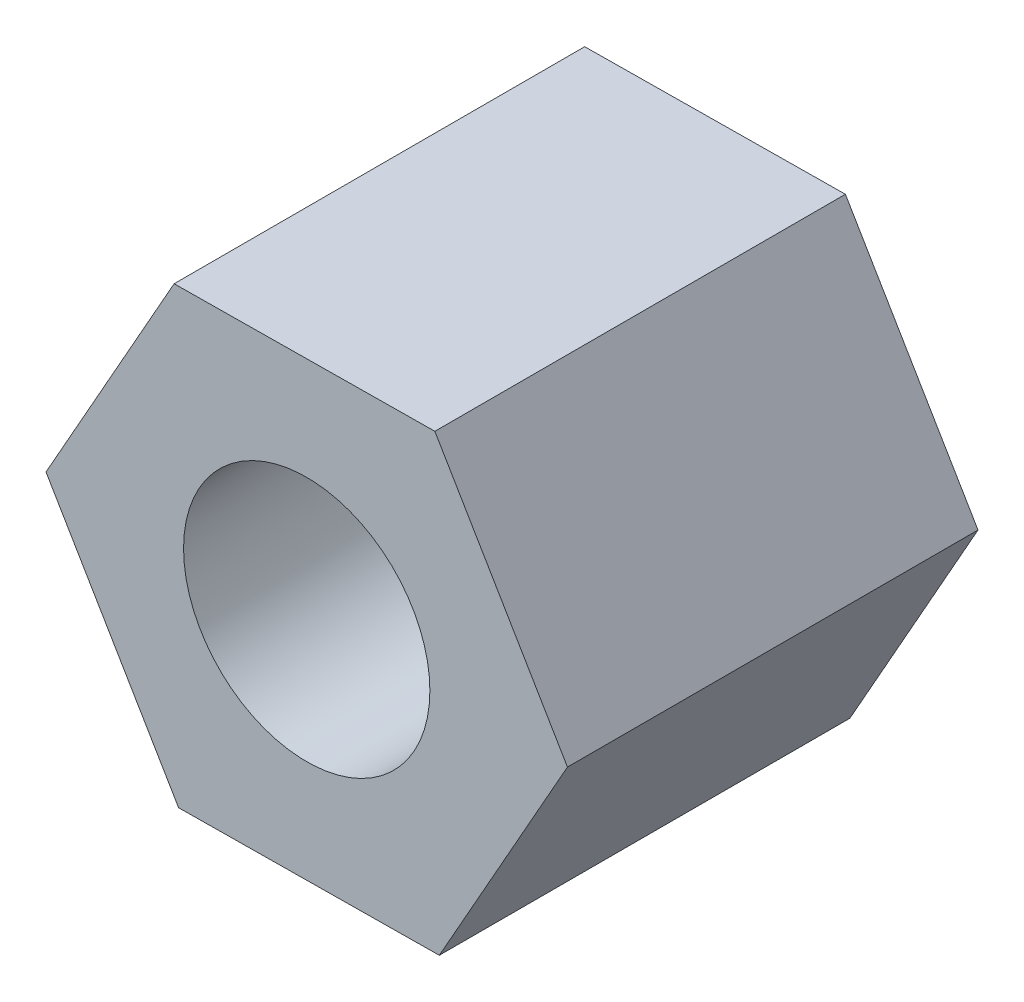
ISO-10303-21;
HEADER;
FILE_DESCRIPTION(('STEP AP214'),'2;1');
FILE_NAME('part.step','',(''),(''),'','','');
FILE_SCHEMA(('AUTOMOTIVE_DESIGN { 1 0 10303 214 1 1 1 1 }'));
ENDSEC;
DATA;
#1=APPLICATION_CONTEXT('core data for automotive mechanical design processes');
#2=APPLICATION_PROTOCOL_DEFINITION('international standard','automotive_design',2000,#1);
#3=PRODUCT_CONTEXT('',#1,'mechanical');
#4=PRODUCT('Part','Part','',(#3));
#5=PRODUCT_RELATED_PRODUCT_CATEGORY('part','',(#4));
#6=PRODUCT_DEFINITION_FORMATION('','',#4);
#7=PRODUCT_DEFINITION_CONTEXT('part definition',#1,'design');
#8=PRODUCT_DEFINITION('design','',#6,#7);
#9=PRODUCT_DEFINITION_SHAPE('','',#8);
#10=(LENGTH_UNIT() NAMED_UNIT(*) SI_UNIT(.MILLI.,.METRE.));
#11=(NAMED_UNIT(*) PLANE_ANGLE_UNIT() SI_UNIT($,.RADIAN.));
#12=(NAMED_UNIT(*) SI_UNIT($,.STERADIAN.) SOLID_ANGLE_UNIT());
#13=UNCERTAINTY_MEASURE_WITH_UNIT(LENGTH_MEASURE(1.E-05),#10,'distance_accuracy_value','');
#14=(GEOMETRIC_REPRESENTATION_CONTEXT(3) GLOBAL_UNCERTAINTY_ASSIGNED_CONTEXT((#13)) GLOBAL_UNIT_ASSIGNED_CONTEXT((#10,
#11,#12)) REPRESENTATION_CONTEXT('',''));
#15=CARTESIAN_POINT('',(0.,0.,0.));
#16=DIRECTION('',(0.,0.,1.));
#17=DIRECTION('',(1.,0.,0.));
#18=AXIS2_PLACEMENT_3D('',#15,#16,#17);
#19=CARTESIAN_POINT('',(0.,0.,5.));
#20=DIRECTION('',(0.,0.,1.));
#21=DIRECTION('',(1.,0.,0.));
#22=AXIS2_PLACEMENT_3D('',#19,#20,#21);
#23=PLANE('',#22);
#24=DIRECTION('',(0.999951160844796,0.00988311313019758,0.));
#25=VECTOR('',#24,1.);
#26=CARTESIAN_POINT('',(-1.56045713659007,-2.7655572418951,5.));
#27=LINE('',#26,#25);
#28=CARTESIAN_POINT('',(-1.56045713659007,-2.7655572418951,5.));
#29=VERTEX_POINT('',#28);
#30=CARTESIAN_POINT('',(1.61481425880615,-2.73417414275127,5.));
#31=VERTEX_POINT('',#30);
#32=EDGE_CURVE('E131',#29,#31,#27,.T.);
#33=ORIENTED_EDGE('',*,*,#32,.T.);
#34=DIRECTION('',(0.491416553383172,0.870924664400432,0.));
#35=VECTOR('',#34,1.);
#36=CARTESIAN_POINT('',(1.61481425880615,-2.73417414275127,5.));
#37=LINE('',#36,#35);
#38=CARTESIAN_POINT('',(3.17527139539622,0.0313830991438299,5.));
#39=VERTEX_POINT('',#38);
#40=EDGE_CURVE('E89',#31,#39,#37,.T.);
#41=ORIENTED_EDGE('',*,*,#40,.T.);
#42=DIRECTION('',(-0.508534607461624,0.861041551270234,0.));
#43=VECTOR('',#42,1.);
#44=CARTESIAN_POINT('',(3.17527139539622,0.0313830991438299,5.));
#45=LINE('',#44,#43);
#46=CARTESIAN_POINT('',(1.56045713659007,2.7655572418951,5.));
#47=VERTEX_POINT('',#46);
#48=EDGE_CURVE('E102',#39,#47,#45,.T.);
#49=ORIENTED_EDGE('',*,*,#48,.T.);
#50=DIRECTION('',(-0.999951160844796,-0.0098831131301969,0.));
#51=VECTOR('',#50,1.);
#52=CARTESIAN_POINT('',(1.56045713659007,2.7655572418951,5.));
#53=LINE('',#52,#51);
#54=CARTESIAN_POINT('',(-1.61481425880615,2.73417414275128,5.));
#55=VERTEX_POINT('',#54);
#56=EDGE_CURVE('E96',#47,#55,#53,.T.);
#57=ORIENTED_EDGE('',*,*,#56,.T.);
#58=DIRECTION('',(-0.491416553383172,-0.870924664400431,0.));
#59=VECTOR('',#58,1.);
#60=CARTESIAN_POINT('',(-1.61481425880615,2.73417414275128,5.));
#61=LINE('',#60,#59);
#62=CARTESIAN_POINT('',(-3.17527139539622,-0.031383099143829,5.));
#63=VERTEX_POINT('',#62);
#64=EDGE_CURVE('E100',#55,#63,#61,.T.);
#65=ORIENTED_EDGE('',*,*,#64,.T.);
#66=DIRECTION('',(0.508534607461624,-0.861041551270235,0.));
#67=VECTOR('',#66,1.);
#68=CARTESIAN_POINT('',(-3.17527139539622,-0.031383099143829,5.));
#69=LINE('',#68,#67);
#70=EDGE_CURVE('E52',#63,#29,#69,.T.);
#71=ORIENTED_EDGE('',*,*,#70,.T.);
#72=EDGE_LOOP('',(#33,#41,#49,#57,#65,#71));
#73=FACE_BOUND('',#72,.T.);
#74=CARTESIAN_POINT('',(0.,0.,5.));
#75=DIRECTION('',(0.,0.,1.));
#76=DIRECTION('',(1.,0.,0.));
#77=AXIS2_PLACEMENT_3D('',#74,#75,#76);
#78=CIRCLE('',#77,1.5);
#79=CARTESIAN_POINT('',(1.5,0.,5.));
#80=VERTEX_POINT('',#79);
#81=EDGE_CURVE('E124',#80,#80,#78,.T.);
#82=ORIENTED_EDGE('',*,*,#81,.F.);
#83=EDGE_LOOP('',(#82));
#84=FACE_BOUND('',#83,.T.);
#85=ADVANCED_FACE('F35',(#73,#84),#23,.T.);
#86=CARTESIAN_POINT('',(0.,0.,0.));
#87=DIRECTION('',(0.,0.,1.));
#88=DIRECTION('',(1.,0.,0.));
#89=AXIS2_PLACEMENT_3D('',#86,#87,#88);
#90=PLANE('',#89);
#91=DIRECTION('',(0.999951160844796,0.00988311313019758,0.));
#92=VECTOR('',#91,1.);
#93=CARTESIAN_POINT('',(-1.56045713659007,-2.7655572418951,0.));
#94=LINE('',#93,#92);
#95=CARTESIAN_POINT('',(-1.56045713659007,-2.7655572418951,0.));
#96=VERTEX_POINT('',#95);
#97=CARTESIAN_POINT('',(1.61481425880615,-2.73417414275127,0.));
#98=VERTEX_POINT('',#97);
#99=EDGE_CURVE('E120',#96,#98,#94,.T.);
#100=ORIENTED_EDGE('',*,*,#99,.F.);
#101=DIRECTION('',(0.508534607461624,-0.861041551270235,0.));
#102=VECTOR('',#101,1.);
#103=CARTESIAN_POINT('',(-3.17527139539622,-0.031383099143829,0.));
#104=LINE('',#103,#102);
#105=CARTESIAN_POINT('',(-3.17527139539622,-0.031383099143829,0.));
#106=VERTEX_POINT('',#105);
#107=EDGE_CURVE('E81',#106,#96,#104,.T.);
#108=ORIENTED_EDGE('',*,*,#107,.F.);
#109=DIRECTION('',(-0.491416553383172,-0.870924664400431,0.));
#110=VECTOR('',#109,1.);
#111=CARTESIAN_POINT('',(-1.61481425880615,2.73417414275128,0.));
#112=LINE('',#111,#110);
#113=CARTESIAN_POINT('',(-1.61481425880615,2.73417414275128,0.));
#114=VERTEX_POINT('',#113);
#115=EDGE_CURVE('E75',#114,#106,#112,.T.);
#116=ORIENTED_EDGE('',*,*,#115,.F.);
#117=DIRECTION('',(-0.999951160844796,-0.0098831131301969,0.));
#118=VECTOR('',#117,1.);
#119=CARTESIAN_POINT('',(1.56045713659007,2.7655572418951,0.));
#120=LINE('',#119,#118);
#121=CARTESIAN_POINT('',(1.56045713659007,2.7655572418951,0.));
#122=VERTEX_POINT('',#121);
#123=EDGE_CURVE('E110',#122,#114,#120,.T.);
#124=ORIENTED_EDGE('',*,*,#123,.F.);
#125=DIRECTION('',(-0.508534607461624,0.861041551270234,0.));
#126=VECTOR('',#125,1.);
#127=CARTESIAN_POINT('',(3.17527139539622,0.0313830991438299,0.));
#128=LINE('',#127,#126);
#129=CARTESIAN_POINT('',(3.17527139539622,0.0313830991438299,0.));
#130=VERTEX_POINT('',#129);
#131=EDGE_CURVE('E126',#130,#122,#128,.T.);
#132=ORIENTED_EDGE('',*,*,#131,.F.);
#133=DIRECTION('',(0.491416553383172,0.870924664400432,0.));
#134=VECTOR('',#133,1.);
#135=CARTESIAN_POINT('',(1.61481425880615,-2.73417414275127,0.));
#136=LINE('',#135,#134);
#137=EDGE_CURVE('E123',#98,#130,#136,.T.);
#138=ORIENTED_EDGE('',*,*,#137,.F.);
#139=EDGE_LOOP('',(#100,#108,#116,#124,#132,#138));
#140=FACE_BOUND('',#139,.T.);
#141=CARTESIAN_POINT('',(0.,0.,0.));
#142=DIRECTION('',(0.,0.,1.));
#143=DIRECTION('',(1.,0.,0.));
#144=AXIS2_PLACEMENT_3D('',#141,#142,#143);
#145=CIRCLE('',#144,1.5);
#146=CARTESIAN_POINT('',(1.5,0.,0.));
#147=VERTEX_POINT('',#146);
#148=EDGE_CURVE('E224',#147,#147,#145,.T.);
#149=ORIENTED_EDGE('',*,*,#148,.T.);
#150=EDGE_LOOP('',(#149));
#151=FACE_BOUND('',#150,.T.);
#152=ADVANCED_FACE('F140',(#140,#151),#90,.F.);
#153=CARTESIAN_POINT('',(-1.56045713659007,-2.7655572418951,5.));
#154=DIRECTION('',(-0.00988311313019758,0.999951160844796,0.));
#155=DIRECTION('',(-0.999951160844796,-0.00988311313019758,0.));
#156=AXIS2_PLACEMENT_3D('',#153,#154,#155);
#157=PLANE('',#156);
#158=ORIENTED_EDGE('',*,*,#99,.T.);
#159=DIRECTION('',(0.,0.,-1.));
#160=VECTOR('',#159,1.);
#161=CARTESIAN_POINT('',(1.61481425880615,-2.73417414275127,5.));
#162=LINE('',#161,#160);
#163=EDGE_CURVE('E11',#31,#98,#162,.T.);
#164=ORIENTED_EDGE('',*,*,#163,.F.);
#165=ORIENTED_EDGE('',*,*,#32,.F.);
#166=DIRECTION('',(0.,0.,-1.));
#167=VECTOR('',#166,1.);
#168=CARTESIAN_POINT('',(-1.56045713659007,-2.7655572418951,5.));
#169=LINE('',#168,#167);
#170=EDGE_CURVE('E116',#29,#96,#169,.T.);
#171=ORIENTED_EDGE('',*,*,#170,.T.);
#172=EDGE_LOOP('',(#158,#164,#165,#171));
#173=FACE_BOUND('',#172,.T.);
#174=ADVANCED_FACE('F37',(#173),#157,.F.);
#175=CARTESIAN_POINT('',(1.61481425880615,-2.73417414275127,5.));
#176=DIRECTION('',(-0.870924664400432,0.491416553383172,0.));
#177=DIRECTION('',(-0.491416553383172,-0.870924664400432,0.));
#178=AXIS2_PLACEMENT_3D('',#175,#176,#177);
#179=PLANE('',#178);
#180=ORIENTED_EDGE('',*,*,#137,.T.);
#181=DIRECTION('',(0.,0.,-1.));
#182=VECTOR('',#181,1.);
#183=CARTESIAN_POINT('',(3.17527139539622,0.0313830991438299,5.));
#184=LINE('',#183,#182);
#185=EDGE_CURVE('E44',#39,#130,#184,.T.);
#186=ORIENTED_EDGE('',*,*,#185,.F.);
#187=ORIENTED_EDGE('',*,*,#40,.F.);
#188=ORIENTED_EDGE('',*,*,#163,.T.);
#189=EDGE_LOOP('',(#180,#186,#187,#188));
#190=FACE_BOUND('',#189,.T.);
#191=ADVANCED_FACE('F165',(#190),#179,.F.);
#192=CARTESIAN_POINT('',(3.17527139539622,0.0313830991438299,5.));
#193=DIRECTION('',(-0.861041551270234,-0.508534607461624,0.));
#194=DIRECTION('',(0.508534607461624,-0.861041551270234,0.));
#195=AXIS2_PLACEMENT_3D('',#192,#193,#194);
#196=PLANE('',#195);
#197=ORIENTED_EDGE('',*,*,#131,.T.);
#198=DIRECTION('',(0.,0.,-1.));
#199=VECTOR('',#198,1.);
#200=CARTESIAN_POINT('',(1.56045713659007,2.7655572418951,5.));
#201=LINE('',#200,#199);
#202=EDGE_CURVE('E111',#47,#122,#201,.T.);
#203=ORIENTED_EDGE('',*,*,#202,.F.);
#204=ORIENTED_EDGE('',*,*,#48,.F.);
#205=ORIENTED_EDGE('',*,*,#185,.T.);
#206=EDGE_LOOP('',(#197,#203,#204,#205));
#207=FACE_BOUND('',#206,.T.);
#208=ADVANCED_FACE('F137',(#207),#196,.F.);
#209=CARTESIAN_POINT('',(1.56045713659007,2.7655572418951,5.));
#210=DIRECTION('',(0.0098831131301969,-0.999951160844796,0.));
#211=DIRECTION('',(0.999951160844796,0.0098831131301969,0.));
#212=AXIS2_PLACEMENT_3D('',#209,#210,#211);
#213=PLANE('',#212);
#214=ORIENTED_EDGE('',*,*,#123,.T.);
#215=DIRECTION('',(0.,0.,-1.));
#216=VECTOR('',#215,1.);
#217=CARTESIAN_POINT('',(-1.61481425880615,2.73417414275128,5.));
#218=LINE('',#217,#216);
#219=EDGE_CURVE('E107',#55,#114,#218,.T.);
#220=ORIENTED_EDGE('',*,*,#219,.F.);
#221=ORIENTED_EDGE('',*,*,#56,.F.);
#222=ORIENTED_EDGE('',*,*,#202,.T.);
#223=EDGE_LOOP('',(#214,#220,#221,#222));
#224=FACE_BOUND('',#223,.T.);
#225=ADVANCED_FACE('F108',(#224),#213,.F.);
#226=CARTESIAN_POINT('',(-1.61481425880615,2.73417414275128,5.));
#227=DIRECTION('',(0.870924664400431,-0.491416553383172,0.));
#228=DIRECTION('',(0.491416553383172,0.870924664400431,0.));
#229=AXIS2_PLACEMENT_3D('',#226,#227,#228);
#230=PLANE('',#229);
#231=ORIENTED_EDGE('',*,*,#115,.T.);
#232=DIRECTION('',(0.,0.,-1.));
#233=VECTOR('',#232,1.);
#234=CARTESIAN_POINT('',(-3.17527139539622,-0.031383099143829,5.));
#235=LINE('',#234,#233);
#236=EDGE_CURVE('E112',#63,#106,#235,.T.);
#237=ORIENTED_EDGE('',*,*,#236,.F.);
#238=ORIENTED_EDGE('',*,*,#64,.F.);
#239=ORIENTED_EDGE('',*,*,#219,.T.);
#240=EDGE_LOOP('',(#231,#237,#238,#239));
#241=FACE_BOUND('',#240,.T.);
#242=ADVANCED_FACE('F114',(#241),#230,.F.);
#243=CARTESIAN_POINT('',(-3.17527139539622,-0.031383099143829,5.));
#244=DIRECTION('',(0.861041551270235,0.508534607461624,0.));
#245=DIRECTION('',(-0.508534607461624,0.861041551270235,0.));
#246=AXIS2_PLACEMENT_3D('',#243,#244,#245);
#247=PLANE('',#246);
#248=ORIENTED_EDGE('',*,*,#107,.T.);
#249=ORIENTED_EDGE('',*,*,#170,.F.);
#250=ORIENTED_EDGE('',*,*,#70,.F.);
#251=ORIENTED_EDGE('',*,*,#236,.T.);
#252=EDGE_LOOP('',(#248,#249,#250,#251));
#253=FACE_BOUND('',#252,.T.);
#254=ADVANCED_FACE('F145',(#253),#247,.F.);
#255=CARTESIAN_POINT('',(0.,0.,5.));
#256=DIRECTION('',(0.,0.,-1.));
#257=DIRECTION('',(-1.,0.,0.));
#258=AXIS2_PLACEMENT_3D('',#255,#256,#257);
#259=CYLINDRICAL_SURFACE('',#258,1.5);
#260=ORIENTED_EDGE('',*,*,#81,.T.);
#261=EDGE_LOOP('',(#260));
#262=FACE_BOUND('',#261,.T.);
#263=ORIENTED_EDGE('',*,*,#148,.F.);
#264=EDGE_LOOP('',(#263));
#265=FACE_BOUND('',#264,.T.);
#266=ADVANCED_FACE('F147',(#262,#265),#259,.F.);
#267=CLOSED_SHELL('',(#85,#152,#174,#191,#208,#225,#242,#254,#266));
#268=MANIFOLD_SOLID_BREP('B2',#267);
#269=ADVANCED_BREP_SHAPE_REPRESENTATION('',(#18,#268),#14);
#270=SHAPE_DEFINITION_REPRESENTATION(#9,#269);
ENDSEC;
END-ISO-10303-21;
